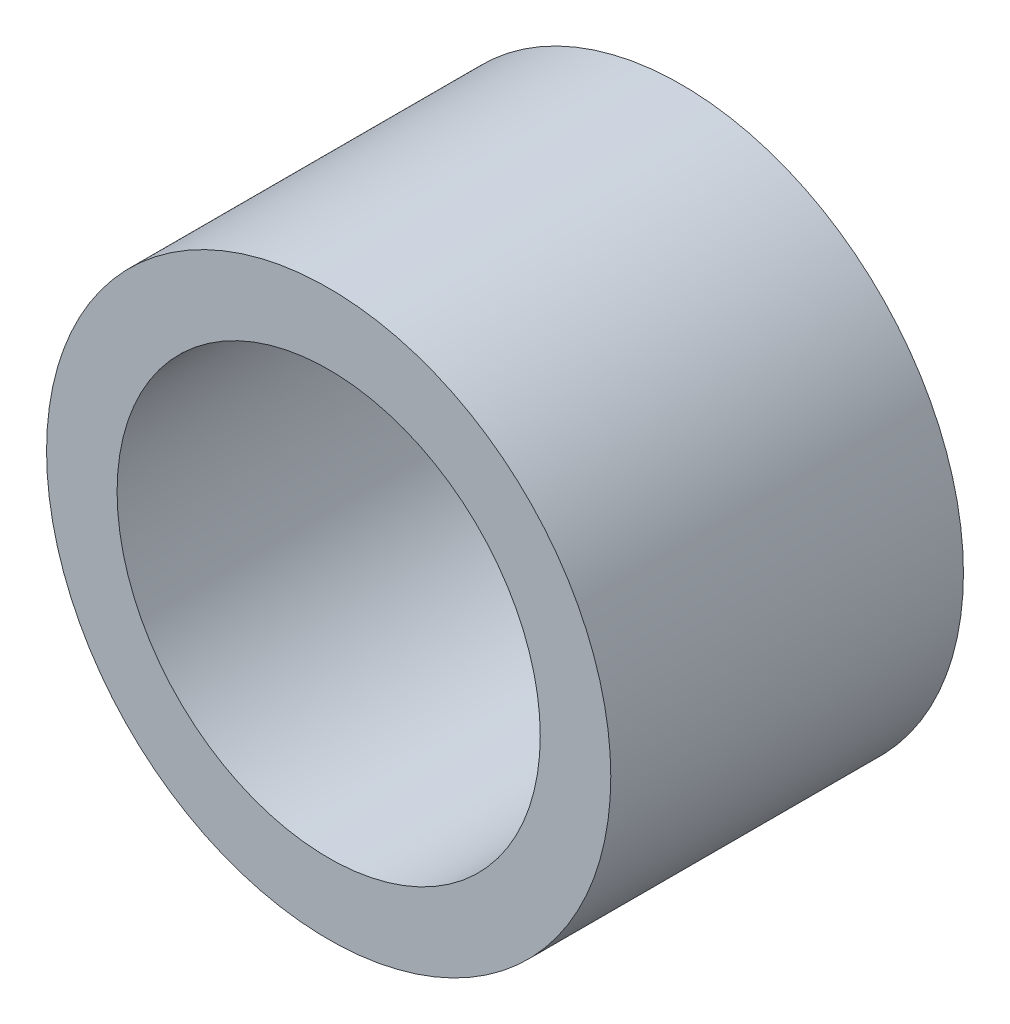
ISO-10303-21;
HEADER;
FILE_DESCRIPTION(('STEP AP214'),'2;1');
FILE_NAME('part.step','',(''),(''),'','','');
FILE_SCHEMA(('AUTOMOTIVE_DESIGN { 1 0 10303 214 1 1 1 1 }'));
ENDSEC;
DATA;
#1=APPLICATION_CONTEXT('core data for automotive mechanical design processes');
#2=APPLICATION_PROTOCOL_DEFINITION('international standard','automotive_design',2000,#1);
#3=PRODUCT_CONTEXT('',#1,'mechanical');
#4=PRODUCT('Part','Part','',(#3));
#5=PRODUCT_RELATED_PRODUCT_CATEGORY('part','',(#4));
#6=PRODUCT_DEFINITION_FORMATION('','',#4);
#7=PRODUCT_DEFINITION_CONTEXT('part definition',#1,'design');
#8=PRODUCT_DEFINITION('design','',#6,#7);
#9=PRODUCT_DEFINITION_SHAPE('','',#8);
#10=(LENGTH_UNIT() NAMED_UNIT(*) SI_UNIT(.MILLI.,.METRE.));
#11=(NAMED_UNIT(*) PLANE_ANGLE_UNIT() SI_UNIT($,.RADIAN.));
#12=(NAMED_UNIT(*) SI_UNIT($,.STERADIAN.) SOLID_ANGLE_UNIT());
#13=UNCERTAINTY_MEASURE_WITH_UNIT(LENGTH_MEASURE(1.E-05),#10,'distance_accuracy_value','');
#14=(GEOMETRIC_REPRESENTATION_CONTEXT(3) GLOBAL_UNCERTAINTY_ASSIGNED_CONTEXT((#13)) GLOBAL_UNIT_ASSIGNED_CONTEXT((#10,
#11,#12)) REPRESENTATION_CONTEXT('',''));
#15=CARTESIAN_POINT('',(0.,0.,0.));
#16=DIRECTION('',(0.,0.,1.));
#17=DIRECTION('',(1.,0.,0.));
#18=AXIS2_PLACEMENT_3D('',#15,#16,#17);
#19=CARTESIAN_POINT('',(0.,0.,5.));
#20=DIRECTION('',(0.,0.,1.));
#21=DIRECTION('',(1.,0.,0.));
#22=AXIS2_PLACEMENT_3D('',#19,#20,#21);
#23=PLANE('',#22);
#24=CARTESIAN_POINT('',(0.,0.,5.));
#25=DIRECTION('',(0.,0.,1.));
#26=DIRECTION('',(1.,0.,0.));
#27=AXIS2_PLACEMENT_3D('',#24,#25,#26);
#28=CIRCLE('',#27,4.);
#29=CARTESIAN_POINT('',(4.,0.,5.));
#30=VERTEX_POINT('',#29);
#31=EDGE_CURVE('E10',#30,#30,#28,.T.);
#32=ORIENTED_EDGE('',*,*,#31,.T.);
#33=EDGE_LOOP('',(#32));
#34=FACE_BOUND('',#33,.T.);
#35=CARTESIAN_POINT('',(0.,0.,5.));
#36=DIRECTION('',(0.,0.,1.));
#37=DIRECTION('',(1.,0.,0.));
#38=AXIS2_PLACEMENT_3D('',#35,#36,#37);
#39=CIRCLE('',#38,3.);
#40=CARTESIAN_POINT('',(3.,0.,5.));
#41=VERTEX_POINT('',#40);
#42=EDGE_CURVE('E43',#41,#41,#39,.T.);
#43=ORIENTED_EDGE('',*,*,#42,.F.);
#44=EDGE_LOOP('',(#43));
#45=FACE_BOUND('',#44,.T.);
#46=ADVANCED_FACE('F32',(#34,#45),#23,.T.);
#47=CARTESIAN_POINT('',(0.,0.,0.));
#48=DIRECTION('',(0.,0.,1.));
#49=DIRECTION('',(1.,0.,0.));
#50=AXIS2_PLACEMENT_3D('',#47,#48,#49);
#51=PLANE('',#50);
#52=CARTESIAN_POINT('',(0.,0.,0.));
#53=DIRECTION('',(0.,0.,1.));
#54=DIRECTION('',(1.,0.,0.));
#55=AXIS2_PLACEMENT_3D('',#52,#53,#54);
#56=CIRCLE('',#55,4.);
#57=CARTESIAN_POINT('',(4.,0.,0.));
#58=VERTEX_POINT('',#57);
#59=EDGE_CURVE('E36',#58,#58,#56,.T.);
#60=ORIENTED_EDGE('',*,*,#59,.F.);
#61=EDGE_LOOP('',(#60));
#62=FACE_BOUND('',#61,.T.);
#63=CARTESIAN_POINT('',(0.,0.,0.));
#64=DIRECTION('',(0.,0.,1.));
#65=DIRECTION('',(1.,0.,0.));
#66=AXIS2_PLACEMENT_3D('',#63,#64,#65);
#67=CIRCLE('',#66,3.);
#68=CARTESIAN_POINT('',(3.,0.,0.));
#69=VERTEX_POINT('',#68);
#70=EDGE_CURVE('E45',#69,#69,#67,.T.);
#71=ORIENTED_EDGE('',*,*,#70,.T.);
#72=EDGE_LOOP('',(#71));
#73=FACE_BOUND('',#72,.T.);
#74=ADVANCED_FACE('F55',(#62,#73),#51,.F.);
#75=CARTESIAN_POINT('',(0.,0.,5.));
#76=DIRECTION('',(0.,0.,-1.));
#77=DIRECTION('',(-1.,0.,0.));
#78=AXIS2_PLACEMENT_3D('',#75,#76,#77);
#79=CYLINDRICAL_SURFACE('',#78,4.);
#80=ORIENTED_EDGE('',*,*,#31,.F.);
#81=EDGE_LOOP('',(#80));
#82=FACE_BOUND('',#81,.T.);
#83=ORIENTED_EDGE('',*,*,#59,.T.);
#84=EDGE_LOOP('',(#83));
#85=FACE_BOUND('',#84,.T.);
#86=ADVANCED_FACE('F34',(#82,#85),#79,.T.);
#87=CARTESIAN_POINT('',(0.,0.,5.));
#88=DIRECTION('',(0.,0.,-1.));
#89=DIRECTION('',(-1.,0.,0.));
#90=AXIS2_PLACEMENT_3D('',#87,#88,#89);
#91=CYLINDRICAL_SURFACE('',#90,3.);
#92=ORIENTED_EDGE('',*,*,#42,.T.);
#93=EDGE_LOOP('',(#92));
#94=FACE_BOUND('',#93,.T.);
#95=ORIENTED_EDGE('',*,*,#70,.F.);
#96=EDGE_LOOP('',(#95));
#97=FACE_BOUND('',#96,.T.);
#98=ADVANCED_FACE('F51',(#94,#97),#91,.F.);
#99=CLOSED_SHELL('',(#46,#74,#86,#98));
#100=MANIFOLD_SOLID_BREP('B2',#99);
#101=ADVANCED_BREP_SHAPE_REPRESENTATION('',(#18,#100),#14);
#102=SHAPE_DEFINITION_REPRESENTATION(#9,#101);
ENDSEC;
END-ISO-10303-21;
